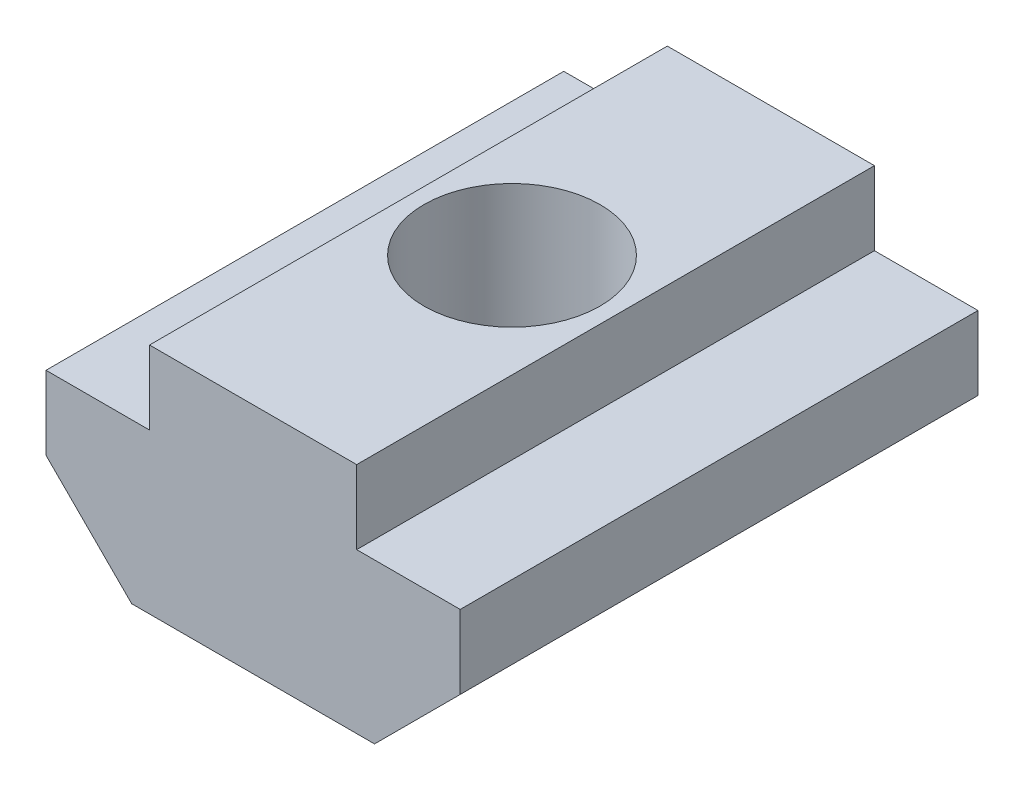
ISO-10303-21;
HEADER;
FILE_DESCRIPTION(('STEP AP214'),'2;1');
FILE_NAME('part.step','',(''),(''),'','','');
FILE_SCHEMA(('AUTOMOTIVE_DESIGN { 1 0 10303 214 1 1 1 1 }'));
ENDSEC;
DATA;
#1=APPLICATION_CONTEXT('core data for automotive mechanical design processes');
#2=APPLICATION_PROTOCOL_DEFINITION('international standard','automotive_design',2000,#1);
#3=PRODUCT_CONTEXT('',#1,'mechanical');
#4=PRODUCT('Part','Part','',(#3));
#5=PRODUCT_RELATED_PRODUCT_CATEGORY('part','',(#4));
#6=PRODUCT_DEFINITION_FORMATION('','',#4);
#7=PRODUCT_DEFINITION_CONTEXT('part definition',#1,'design');
#8=PRODUCT_DEFINITION('design','',#6,#7);
#9=PRODUCT_DEFINITION_SHAPE('','',#8);
#10=(LENGTH_UNIT() NAMED_UNIT(*) SI_UNIT(.MILLI.,.METRE.));
#11=(NAMED_UNIT(*) PLANE_ANGLE_UNIT() SI_UNIT($,.RADIAN.));
#12=(NAMED_UNIT(*) SI_UNIT($,.STERADIAN.) SOLID_ANGLE_UNIT());
#13=UNCERTAINTY_MEASURE_WITH_UNIT(LENGTH_MEASURE(1.E-05),#10,'distance_accuracy_value','');
#14=(GEOMETRIC_REPRESENTATION_CONTEXT(3) GLOBAL_UNCERTAINTY_ASSIGNED_CONTEXT((#13)) GLOBAL_UNIT_ASSIGNED_CONTEXT((#10,
#11,#12)) REPRESENTATION_CONTEXT('',''));
#15=CARTESIAN_POINT('',(0.,0.,0.));
#16=DIRECTION('',(0.,0.,1.));
#17=DIRECTION('',(1.,0.,0.));
#18=AXIS2_PLACEMENT_3D('',#15,#16,#17);
#19=CARTESIAN_POINT('',(12.3427461369096,0.38993814555922,20.));
#20=DIRECTION('',(0.,1.,0.));
#21=DIRECTION('',(-1.,0.,0.));
#22=AXIS2_PLACEMENT_3D('',#19,#20,#21);
#23=PLANE('',#22);
#24=CARTESIAN_POINT('',(7.6531461369096,0.389938145559219,10.));
#25=DIRECTION('',(0.,-1.,0.));
#26=DIRECTION('',(0.,0.,-1.));
#27=AXIS2_PLACEMENT_3D('',#24,#25,#26);
#28=CIRCLE('',#27,3.39999999999999);
#29=CARTESIAN_POINT('',(7.6531461369096,0.389938145559219,6.60000000000001));
#30=VERTEX_POINT('',#29);
#31=EDGE_CURVE('E210',#30,#30,#28,.T.);
#32=ORIENTED_EDGE('',*,*,#31,.F.);
#33=EDGE_LOOP('',(#32));
#34=FACE_BOUND('',#33,.T.);
#35=DIRECTION('',(1.,0.,0.));
#36=VECTOR('',#35,1.);
#37=CARTESIAN_POINT('',(12.3427461369096,0.38993814555922,0.));
#38=LINE('',#37,#36);
#39=CARTESIAN_POINT('',(2.9635461369096,0.389938145559221,0.));
#40=VERTEX_POINT('',#39);
#41=CARTESIAN_POINT('',(12.3427461369096,0.38993814555922,0.));
#42=VERTEX_POINT('',#41);
#43=EDGE_CURVE('E142',#40,#42,#38,.T.);
#44=ORIENTED_EDGE('',*,*,#43,.T.);
#45=DIRECTION('',(0.,0.,-1.));
#46=VECTOR('',#45,1.);
#47=CARTESIAN_POINT('',(12.3427461369096,0.38993814555922,20.));
#48=LINE('',#47,#46);
#49=CARTESIAN_POINT('',(12.3427461369096,0.38993814555922,20.));
#50=VERTEX_POINT('',#49);
#51=EDGE_CURVE('E11',#50,#42,#48,.T.);
#52=ORIENTED_EDGE('',*,*,#51,.F.);
#53=DIRECTION('',(1.,0.,0.));
#54=VECTOR('',#53,1.);
#55=CARTESIAN_POINT('',(12.3427461369096,0.38993814555922,20.));
#56=LINE('',#55,#54);
#57=CARTESIAN_POINT('',(2.9635461369096,0.389938145559221,20.));
#58=VERTEX_POINT('',#57);
#59=EDGE_CURVE('E161',#58,#50,#56,.T.);
#60=ORIENTED_EDGE('',*,*,#59,.F.);
#61=DIRECTION('',(0.,0.,-1.));
#62=VECTOR('',#61,1.);
#63=CARTESIAN_POINT('',(2.9635461369096,0.389938145559221,20.));
#64=LINE('',#63,#62);
#65=EDGE_CURVE('E138',#58,#40,#64,.T.);
#66=ORIENTED_EDGE('',*,*,#65,.T.);
#67=EDGE_LOOP('',(#44,#52,#60,#66));
#68=FACE_BOUND('',#67,.T.);
#69=ADVANCED_FACE('F34',(#34,#68),#23,.F.);
#70=CARTESIAN_POINT('',(15.6531461369096,3.70033814555922,20.));
#71=DIRECTION('',(-0.707106781186548,0.707106781186547,0.));
#72=DIRECTION('',(-0.707106781186547,-0.707106781186548,0.));
#73=AXIS2_PLACEMENT_3D('',#70,#71,#72);
#74=PLANE('',#73);
#75=DIRECTION('',(0.707106781186547,0.707106781186548,0.));
#76=VECTOR('',#75,1.);
#77=CARTESIAN_POINT('',(15.6531461369096,3.70033814555922,0.));
#78=LINE('',#77,#76);
#79=CARTESIAN_POINT('',(15.6531461369096,3.70033814555922,0.));
#80=VERTEX_POINT('',#79);
#81=EDGE_CURVE('E145',#42,#80,#78,.T.);
#82=ORIENTED_EDGE('',*,*,#81,.T.);
#83=DIRECTION('',(0.,0.,-1.));
#84=VECTOR('',#83,1.);
#85=CARTESIAN_POINT('',(15.6531461369096,3.70033814555922,20.));
#86=LINE('',#85,#84);
#87=CARTESIAN_POINT('',(15.6531461369096,3.70033814555922,20.));
#88=VERTEX_POINT('',#87);
#89=EDGE_CURVE('E42',#88,#80,#86,.T.);
#90=ORIENTED_EDGE('',*,*,#89,.F.);
#91=DIRECTION('',(0.707106781186547,0.707106781186548,0.));
#92=VECTOR('',#91,1.);
#93=CARTESIAN_POINT('',(15.6531461369096,3.70033814555922,20.));
#94=LINE('',#93,#92);
#95=EDGE_CURVE('E99',#50,#88,#94,.T.);
#96=ORIENTED_EDGE('',*,*,#95,.F.);
#97=ORIENTED_EDGE('',*,*,#51,.T.);
#98=EDGE_LOOP('',(#82,#90,#96,#97));
#99=FACE_BOUND('',#98,.T.);
#100=ADVANCED_FACE('F218',(#99),#74,.F.);
#101=CARTESIAN_POINT('',(15.6531461369096,6.54513814555922,20.));
#102=DIRECTION('',(-1.,0.,0.));
#103=DIRECTION('',(0.,0.,1.));
#104=AXIS2_PLACEMENT_3D('',#101,#102,#103);
#105=PLANE('',#104);
#106=DIRECTION('',(0.,1.,0.));
#107=VECTOR('',#106,1.);
#108=CARTESIAN_POINT('',(15.6531461369096,6.54513814555922,0.));
#109=LINE('',#108,#107);
#110=CARTESIAN_POINT('',(15.6531461369096,6.54513814555922,0.));
#111=VERTEX_POINT('',#110);
#112=EDGE_CURVE('E148',#80,#111,#109,.T.);
#113=ORIENTED_EDGE('',*,*,#112,.T.);
#114=DIRECTION('',(0.,0.,-1.));
#115=VECTOR('',#114,1.);
#116=CARTESIAN_POINT('',(15.6531461369096,6.54513814555922,20.));
#117=LINE('',#116,#115);
#118=CARTESIAN_POINT('',(15.6531461369096,6.54513814555922,20.));
#119=VERTEX_POINT('',#118);
#120=EDGE_CURVE('E174',#119,#111,#117,.T.);
#121=ORIENTED_EDGE('',*,*,#120,.F.);
#122=DIRECTION('',(0.,1.,0.));
#123=VECTOR('',#122,1.);
#124=CARTESIAN_POINT('',(15.6531461369096,6.54513814555922,20.));
#125=LINE('',#124,#123);
#126=EDGE_CURVE('E182',#88,#119,#125,.T.);
#127=ORIENTED_EDGE('',*,*,#126,.F.);
#128=ORIENTED_EDGE('',*,*,#89,.T.);
#129=EDGE_LOOP('',(#113,#121,#127,#128));
#130=FACE_BOUND('',#129,.T.);
#131=ADVANCED_FACE('F180',(#130),#105,.F.);
#132=CARTESIAN_POINT('',(11.6536461369096,6.54513814555922,20.));
#133=DIRECTION('',(0.,-1.,0.));
#134=DIRECTION('',(0.,0.,-1.));
#135=AXIS2_PLACEMENT_3D('',#132,#133,#134);
#136=PLANE('',#135);
#137=DIRECTION('',(-1.,0.,0.));
#138=VECTOR('',#137,1.);
#139=CARTESIAN_POINT('',(11.6536461369096,6.54513814555922,0.));
#140=LINE('',#139,#138);
#141=CARTESIAN_POINT('',(11.6536461369096,6.54513814555922,0.));
#142=VERTEX_POINT('',#141);
#143=EDGE_CURVE('E150',#111,#142,#140,.T.);
#144=ORIENTED_EDGE('',*,*,#143,.T.);
#145=DIRECTION('',(0.,0.,-1.));
#146=VECTOR('',#145,1.);
#147=CARTESIAN_POINT('',(11.6536461369096,6.54513814555922,20.));
#148=LINE('',#147,#146);
#149=CARTESIAN_POINT('',(11.6536461369096,6.54513814555922,20.));
#150=VERTEX_POINT('',#149);
#151=EDGE_CURVE('E171',#150,#142,#148,.T.);
#152=ORIENTED_EDGE('',*,*,#151,.F.);
#153=DIRECTION('',(-1.,0.,0.));
#154=VECTOR('',#153,1.);
#155=CARTESIAN_POINT('',(11.6536461369096,6.54513814555922,20.));
#156=LINE('',#155,#154);
#157=EDGE_CURVE('E200',#119,#150,#156,.T.);
#158=ORIENTED_EDGE('',*,*,#157,.F.);
#159=ORIENTED_EDGE('',*,*,#120,.T.);
#160=EDGE_LOOP('',(#144,#152,#158,#159));
#161=FACE_BOUND('',#160,.T.);
#162=ADVANCED_FACE('F191',(#161),#136,.F.);
#163=CARTESIAN_POINT('',(11.6536461369096,9.38993814555922,20.));
#164=DIRECTION('',(-1.,0.,0.));
#165=DIRECTION('',(0.,0.,1.));
#166=AXIS2_PLACEMENT_3D('',#163,#164,#165);
#167=PLANE('',#166);
#168=DIRECTION('',(0.,1.,0.));
#169=VECTOR('',#168,1.);
#170=CARTESIAN_POINT('',(11.6536461369096,9.38993814555922,0.));
#171=LINE('',#170,#169);
#172=CARTESIAN_POINT('',(11.6536461369096,9.38993814555922,0.));
#173=VERTEX_POINT('',#172);
#174=EDGE_CURVE('E152',#142,#173,#171,.T.);
#175=ORIENTED_EDGE('',*,*,#174,.T.);
#176=DIRECTION('',(0.,0.,-1.));
#177=VECTOR('',#176,1.);
#178=CARTESIAN_POINT('',(11.6536461369096,9.38993814555922,20.));
#179=LINE('',#178,#177);
#180=CARTESIAN_POINT('',(11.6536461369096,9.38993814555922,20.));
#181=VERTEX_POINT('',#180);
#182=EDGE_CURVE('E168',#181,#173,#179,.T.);
#183=ORIENTED_EDGE('',*,*,#182,.F.);
#184=DIRECTION('',(0.,1.,0.));
#185=VECTOR('',#184,1.);
#186=CARTESIAN_POINT('',(11.6536461369096,9.38993814555922,20.));
#187=LINE('',#186,#185);
#188=EDGE_CURVE('E197',#150,#181,#187,.T.);
#189=ORIENTED_EDGE('',*,*,#188,.F.);
#190=ORIENTED_EDGE('',*,*,#151,.T.);
#191=EDGE_LOOP('',(#175,#183,#189,#190));
#192=FACE_BOUND('',#191,.T.);
#193=ADVANCED_FACE('F195',(#192),#167,.F.);
#194=CARTESIAN_POINT('',(3.6526461369096,9.38993814555922,20.));
#195=DIRECTION('',(0.,-1.,0.));
#196=DIRECTION('',(0.,0.,-1.));
#197=AXIS2_PLACEMENT_3D('',#194,#195,#196);
#198=PLANE('',#197);
#199=CARTESIAN_POINT('',(7.6531461369096,9.38993814555922,10.));
#200=DIRECTION('',(0.,-1.,0.));
#201=DIRECTION('',(0.,0.,-1.));
#202=AXIS2_PLACEMENT_3D('',#199,#200,#201);
#203=CIRCLE('',#202,3.4);
#204=CARTESIAN_POINT('',(7.6531461369096,9.38993814555922,6.6));
#205=VERTEX_POINT('',#204);
#206=EDGE_CURVE('E146',#205,#205,#203,.T.);
#207=ORIENTED_EDGE('',*,*,#206,.T.);
#208=EDGE_LOOP('',(#207));
#209=FACE_BOUND('',#208,.T.);
#210=DIRECTION('',(-1.,0.,0.));
#211=VECTOR('',#210,1.);
#212=CARTESIAN_POINT('',(3.6526461369096,9.38993814555922,0.));
#213=LINE('',#212,#211);
#214=CARTESIAN_POINT('',(3.6526461369096,9.38993814555922,0.));
#215=VERTEX_POINT('',#214);
#216=EDGE_CURVE('E154',#173,#215,#213,.T.);
#217=ORIENTED_EDGE('',*,*,#216,.T.);
#218=DIRECTION('',(0.,0.,-1.));
#219=VECTOR('',#218,1.);
#220=CARTESIAN_POINT('',(3.6526461369096,9.38993814555922,20.));
#221=LINE('',#220,#219);
#222=CARTESIAN_POINT('',(3.6526461369096,9.38993814555922,20.));
#223=VERTEX_POINT('',#222);
#224=EDGE_CURVE('E165',#223,#215,#221,.T.);
#225=ORIENTED_EDGE('',*,*,#224,.F.);
#226=DIRECTION('',(-1.,0.,0.));
#227=VECTOR('',#226,1.);
#228=CARTESIAN_POINT('',(3.6526461369096,9.38993814555922,20.));
#229=LINE('',#228,#227);
#230=EDGE_CURVE('E199',#181,#223,#229,.T.);
#231=ORIENTED_EDGE('',*,*,#230,.F.);
#232=ORIENTED_EDGE('',*,*,#182,.T.);
#233=EDGE_LOOP('',(#217,#225,#231,#232));
#234=FACE_BOUND('',#233,.T.);
#235=ADVANCED_FACE('F226',(#209,#234),#198,.F.);
#236=CARTESIAN_POINT('',(3.6526461369096,6.54513814555922,20.));
#237=DIRECTION('',(1.,0.,0.));
#238=DIRECTION('',(0.,0.,-1.));
#239=AXIS2_PLACEMENT_3D('',#236,#237,#238);
#240=PLANE('',#239);
#241=DIRECTION('',(0.,-1.,0.));
#242=VECTOR('',#241,1.);
#243=CARTESIAN_POINT('',(3.6526461369096,6.54513814555922,0.));
#244=LINE('',#243,#242);
#245=CARTESIAN_POINT('',(3.6526461369096,6.54513814555922,0.));
#246=VERTEX_POINT('',#245);
#247=EDGE_CURVE('E156',#215,#246,#244,.T.);
#248=ORIENTED_EDGE('',*,*,#247,.T.);
#249=DIRECTION('',(0.,0.,-1.));
#250=VECTOR('',#249,1.);
#251=CARTESIAN_POINT('',(3.6526461369096,6.54513814555922,20.));
#252=LINE('',#251,#250);
#253=CARTESIAN_POINT('',(3.6526461369096,6.54513814555922,20.));
#254=VERTEX_POINT('',#253);
#255=EDGE_CURVE('E133',#254,#246,#252,.T.);
#256=ORIENTED_EDGE('',*,*,#255,.F.);
#257=DIRECTION('',(0.,-1.,0.));
#258=VECTOR('',#257,1.);
#259=CARTESIAN_POINT('',(3.6526461369096,6.54513814555922,20.));
#260=LINE('',#259,#258);
#261=EDGE_CURVE('E124',#223,#254,#260,.T.);
#262=ORIENTED_EDGE('',*,*,#261,.F.);
#263=ORIENTED_EDGE('',*,*,#224,.T.);
#264=EDGE_LOOP('',(#248,#256,#262,#263));
#265=FACE_BOUND('',#264,.T.);
#266=ADVANCED_FACE('F223',(#265),#240,.F.);
#267=CARTESIAN_POINT('',(-0.346853863090402,6.54513814555922,20.));
#268=DIRECTION('',(0.,-1.,0.));
#269=DIRECTION('',(0.,0.,-1.));
#270=AXIS2_PLACEMENT_3D('',#267,#268,#269);
#271=PLANE('',#270);
#272=DIRECTION('',(-1.,0.,0.));
#273=VECTOR('',#272,1.);
#274=CARTESIAN_POINT('',(-0.346853863090402,6.54513814555922,0.));
#275=LINE('',#274,#273);
#276=CARTESIAN_POINT('',(-0.346853863090402,6.54513814555922,0.));
#277=VERTEX_POINT('',#276);
#278=EDGE_CURVE('E132',#246,#277,#275,.T.);
#279=ORIENTED_EDGE('',*,*,#278,.T.);
#280=DIRECTION('',(0.,0.,-1.));
#281=VECTOR('',#280,1.);
#282=CARTESIAN_POINT('',(-0.346853863090402,6.54513814555922,20.));
#283=LINE('',#282,#281);
#284=CARTESIAN_POINT('',(-0.346853863090402,6.54513814555922,20.));
#285=VERTEX_POINT('',#284);
#286=EDGE_CURVE('E129',#285,#277,#283,.T.);
#287=ORIENTED_EDGE('',*,*,#286,.F.);
#288=DIRECTION('',(-1.,0.,0.));
#289=VECTOR('',#288,1.);
#290=CARTESIAN_POINT('',(-0.346853863090402,6.54513814555922,20.));
#291=LINE('',#290,#289);
#292=EDGE_CURVE('E118',#254,#285,#291,.T.);
#293=ORIENTED_EDGE('',*,*,#292,.F.);
#294=ORIENTED_EDGE('',*,*,#255,.T.);
#295=EDGE_LOOP('',(#279,#287,#293,#294));
#296=FACE_BOUND('',#295,.T.);
#297=ADVANCED_FACE('F130',(#296),#271,.F.);
#298=CARTESIAN_POINT('',(-0.346853863090402,3.70033814555922,20.));
#299=DIRECTION('',(1.,0.,0.));
#300=DIRECTION('',(0.,1.,0.));
#301=AXIS2_PLACEMENT_3D('',#298,#299,#300);
#302=PLANE('',#301);
#303=DIRECTION('',(0.,-1.,0.));
#304=VECTOR('',#303,1.);
#305=CARTESIAN_POINT('',(-0.346853863090402,3.70033814555922,0.));
#306=LINE('',#305,#304);
#307=CARTESIAN_POINT('',(-0.346853863090402,3.70033814555922,0.));
#308=VERTEX_POINT('',#307);
#309=EDGE_CURVE('E85',#277,#308,#306,.T.);
#310=ORIENTED_EDGE('',*,*,#309,.T.);
#311=DIRECTION('',(0.,0.,-1.));
#312=VECTOR('',#311,1.);
#313=CARTESIAN_POINT('',(-0.346853863090402,3.70033814555922,20.));
#314=LINE('',#313,#312);
#315=CARTESIAN_POINT('',(-0.346853863090402,3.70033814555922,20.));
#316=VERTEX_POINT('',#315);
#317=EDGE_CURVE('E134',#316,#308,#314,.T.);
#318=ORIENTED_EDGE('',*,*,#317,.F.);
#319=DIRECTION('',(0.,-1.,0.));
#320=VECTOR('',#319,1.);
#321=CARTESIAN_POINT('',(-0.346853863090402,3.70033814555922,20.));
#322=LINE('',#321,#320);
#323=EDGE_CURVE('E122',#285,#316,#322,.T.);
#324=ORIENTED_EDGE('',*,*,#323,.F.);
#325=ORIENTED_EDGE('',*,*,#286,.T.);
#326=EDGE_LOOP('',(#310,#318,#324,#325));
#327=FACE_BOUND('',#326,.T.);
#328=ADVANCED_FACE('F136',(#327),#302,.F.);
#329=CARTESIAN_POINT('',(2.9635461369096,0.389938145559221,20.));
#330=DIRECTION('',(0.707106781186548,0.707106781186547,0.));
#331=DIRECTION('',(-0.707106781186547,0.707106781186548,0.));
#332=AXIS2_PLACEMENT_3D('',#329,#330,#331);
#333=PLANE('',#332);
#334=DIRECTION('',(0.707106781186547,-0.707106781186548,0.));
#335=VECTOR('',#334,1.);
#336=CARTESIAN_POINT('',(2.9635461369096,0.389938145559221,0.));
#337=LINE('',#336,#335);
#338=EDGE_CURVE('E91',#308,#40,#337,.T.);
#339=ORIENTED_EDGE('',*,*,#338,.T.);
#340=ORIENTED_EDGE('',*,*,#65,.F.);
#341=DIRECTION('',(0.707106781186547,-0.707106781186548,0.));
#342=VECTOR('',#341,1.);
#343=CARTESIAN_POINT('',(2.9635461369096,0.389938145559221,20.));
#344=LINE('',#343,#342);
#345=EDGE_CURVE('E50',#316,#58,#344,.T.);
#346=ORIENTED_EDGE('',*,*,#345,.F.);
#347=ORIENTED_EDGE('',*,*,#317,.T.);
#348=EDGE_LOOP('',(#339,#340,#346,#347));
#349=FACE_BOUND('',#348,.T.);
#350=ADVANCED_FACE('F281',(#349),#333,.F.);
#351=CARTESIAN_POINT('',(-0.346853863090402,0.38993814555922,20.));
#352=DIRECTION('',(0.,0.,-1.));
#353=DIRECTION('',(-1.,0.,0.));
#354=AXIS2_PLACEMENT_3D('',#351,#352,#353);
#355=PLANE('',#354);
#356=ORIENTED_EDGE('',*,*,#59,.T.);
#357=ORIENTED_EDGE('',*,*,#95,.T.);
#358=ORIENTED_EDGE('',*,*,#126,.T.);
#359=ORIENTED_EDGE('',*,*,#157,.T.);
#360=ORIENTED_EDGE('',*,*,#188,.T.);
#361=ORIENTED_EDGE('',*,*,#230,.T.);
#362=ORIENTED_EDGE('',*,*,#261,.T.);
#363=ORIENTED_EDGE('',*,*,#292,.T.);
#364=ORIENTED_EDGE('',*,*,#323,.T.);
#365=ORIENTED_EDGE('',*,*,#345,.T.);
#366=EDGE_LOOP('',(#356,#357,#358,#359,#360,#361,#362,#363,#364,#365));
#367=FACE_BOUND('',#366,.T.);
#368=ADVANCED_FACE('F120',(#367),#355,.F.);
#369=CARTESIAN_POINT('',(-0.346853863090402,0.38993814555922,0.));
#370=DIRECTION('',(0.,0.,-1.));
#371=DIRECTION('',(-1.,0.,0.));
#372=AXIS2_PLACEMENT_3D('',#369,#370,#371);
#373=PLANE('',#372);
#374=ORIENTED_EDGE('',*,*,#43,.F.);
#375=ORIENTED_EDGE('',*,*,#338,.F.);
#376=ORIENTED_EDGE('',*,*,#309,.F.);
#377=ORIENTED_EDGE('',*,*,#278,.F.);
#378=ORIENTED_EDGE('',*,*,#247,.F.);
#379=ORIENTED_EDGE('',*,*,#216,.F.);
#380=ORIENTED_EDGE('',*,*,#174,.F.);
#381=ORIENTED_EDGE('',*,*,#143,.F.);
#382=ORIENTED_EDGE('',*,*,#112,.F.);
#383=ORIENTED_EDGE('',*,*,#81,.F.);
#384=EDGE_LOOP('',(#374,#375,#376,#377,#378,#379,#380,#381,#382,#383));
#385=FACE_BOUND('',#384,.T.);
#386=ADVANCED_FACE('F186',(#385),#373,.T.);
#387=CARTESIAN_POINT('',(7.6531461369096,0.38993814555922,10.));
#388=DIRECTION('',(0.,-1.,0.));
#389=DIRECTION('',(0.,0.,-1.));
#390=AXIS2_PLACEMENT_3D('',#387,#388,#389);
#391=CYLINDRICAL_SURFACE('',#390,3.39999999999999);
#392=ORIENTED_EDGE('',*,*,#206,.F.);
#393=EDGE_LOOP('',(#392));
#394=FACE_BOUND('',#393,.T.);
#395=ORIENTED_EDGE('',*,*,#31,.T.);
#396=EDGE_LOOP('',(#395));
#397=FACE_BOUND('',#396,.T.);
#398=ADVANCED_FACE('F214',(#394,#397),#391,.F.);
#399=CLOSED_SHELL('',(#69,#100,#131,#162,#193,#235,#266,#297,#328,#350,#368,#386,#398));
#400=MANIFOLD_SOLID_BREP('B2',#399);
#401=ADVANCED_BREP_SHAPE_REPRESENTATION('',(#18,#400),#14);
#402=SHAPE_DEFINITION_REPRESENTATION(#9,#401);
ENDSEC;
END-ISO-10303-21;
